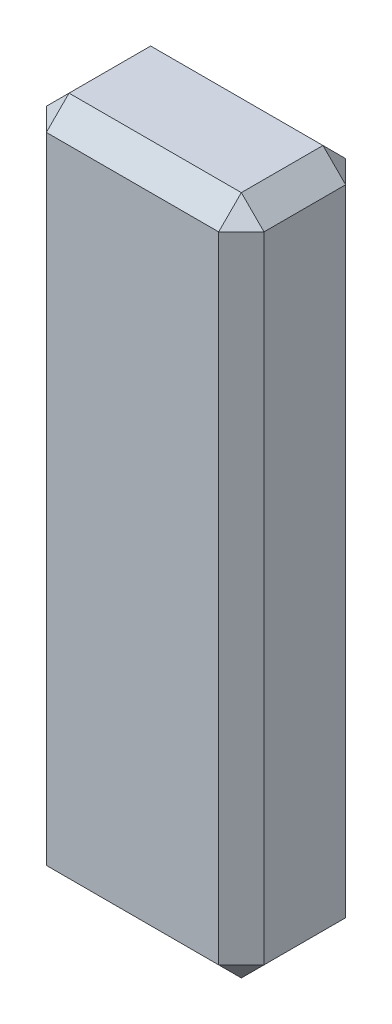
ISO-10303-21;
HEADER;
FILE_DESCRIPTION(('STEP AP214'),'2;1');
FILE_NAME('part.step','',(''),(''),'','','');
FILE_SCHEMA(('AUTOMOTIVE_DESIGN { 1 0 10303 214 1 1 1 1 }'));
ENDSEC;
DATA;
#1=APPLICATION_CONTEXT('core data for automotive mechanical design processes');
#2=APPLICATION_PROTOCOL_DEFINITION('international standard','automotive_design',2000,#1);
#3=PRODUCT_CONTEXT('',#1,'mechanical');
#4=PRODUCT('Part','Part','',(#3));
#5=PRODUCT_RELATED_PRODUCT_CATEGORY('part','',(#4));
#6=PRODUCT_DEFINITION_FORMATION('','',#4);
#7=PRODUCT_DEFINITION_CONTEXT('part definition',#1,'design');
#8=PRODUCT_DEFINITION('design','',#6,#7);
#9=PRODUCT_DEFINITION_SHAPE('','',#8);
#10=(LENGTH_UNIT() NAMED_UNIT(*) SI_UNIT(.MILLI.,.METRE.));
#11=(NAMED_UNIT(*) PLANE_ANGLE_UNIT() SI_UNIT($,.RADIAN.));
#12=(NAMED_UNIT(*) SI_UNIT($,.STERADIAN.) SOLID_ANGLE_UNIT());
#13=UNCERTAINTY_MEASURE_WITH_UNIT(LENGTH_MEASURE(1.E-05),#10,'distance_accuracy_value','');
#14=(GEOMETRIC_REPRESENTATION_CONTEXT(3) GLOBAL_UNCERTAINTY_ASSIGNED_CONTEXT((#13)) GLOBAL_UNIT_ASSIGNED_CONTEXT((#10,
#11,#12)) REPRESENTATION_CONTEXT('',''));
#15=CARTESIAN_POINT('',(0.,0.,0.));
#16=DIRECTION('',(0.,0.,1.));
#17=DIRECTION('',(1.,0.,0.));
#18=AXIS2_PLACEMENT_3D('',#15,#16,#17);
#19=CARTESIAN_POINT('',(2.4,15.,1.4));
#20=DIRECTION('',(-1.,0.,0.));
#21=DIRECTION('',(0.,0.,1.));
#22=AXIS2_PLACEMENT_3D('',#19,#20,#21);
#23=PLANE('',#22);
#24=DIRECTION('',(0.,-1.,0.));
#25=VECTOR('',#24,1.);
#26=CARTESIAN_POINT('',(2.4,15.,0.899999999999998));
#27=LINE('',#26,#25);
#28=CARTESIAN_POINT('',(2.4,14.5,0.899999999999998));
#29=VERTEX_POINT('',#28);
#30=CARTESIAN_POINT('',(2.4,0.500000000000002,0.899999999999998));
#31=VERTEX_POINT('',#30);
#32=EDGE_CURVE('E197',#29,#31,#27,.T.);
#33=ORIENTED_EDGE('',*,*,#32,.T.);
#34=DIRECTION('',(0.,0.,-1.));
#35=VECTOR('',#34,1.);
#36=CARTESIAN_POINT('',(2.4,0.500000000000002,-1.4));
#37=LINE('',#36,#35);
#38=CARTESIAN_POINT('',(2.4,0.500000000000002,-0.899999999999996));
#39=VERTEX_POINT('',#38);
#40=EDGE_CURVE('E200',#31,#39,#37,.T.);
#41=ORIENTED_EDGE('',*,*,#40,.T.);
#42=DIRECTION('',(0.,1.,0.));
#43=VECTOR('',#42,1.);
#44=CARTESIAN_POINT('',(2.4,15.,-0.899999999999996));
#45=LINE('',#44,#43);
#46=CARTESIAN_POINT('',(2.4,14.5,-0.899999999999996));
#47=VERTEX_POINT('',#46);
#48=EDGE_CURVE('E191',#39,#47,#45,.T.);
#49=ORIENTED_EDGE('',*,*,#48,.T.);
#50=DIRECTION('',(0.,0.,1.));
#51=VECTOR('',#50,1.);
#52=CARTESIAN_POINT('',(2.4,14.5,1.4));
#53=LINE('',#52,#51);
#54=EDGE_CURVE('E194',#47,#29,#53,.T.);
#55=ORIENTED_EDGE('',*,*,#54,.T.);
#56=EDGE_LOOP('',(#33,#41,#49,#55));
#57=FACE_BOUND('',#56,.T.);
#58=ADVANCED_FACE('F39',(#57),#23,.F.);
#59=CARTESIAN_POINT('',(-2.4,15.,-1.4));
#60=DIRECTION('',(0.,0.,1.));
#61=DIRECTION('',(1.,0.,0.));
#62=AXIS2_PLACEMENT_3D('',#59,#60,#61);
#63=PLANE('',#62);
#64=DIRECTION('',(1.,0.,0.));
#65=VECTOR('',#64,1.);
#66=CARTESIAN_POINT('',(-2.4,14.5,-1.4));
#67=LINE('',#66,#65);
#68=CARTESIAN_POINT('',(-1.9,14.5,-1.4));
#69=VERTEX_POINT('',#68);
#70=CARTESIAN_POINT('',(1.9,14.5,-1.4));
#71=VERTEX_POINT('',#70);
#72=EDGE_CURVE('E49',#69,#71,#67,.T.);
#73=ORIENTED_EDGE('',*,*,#72,.T.);
#74=DIRECTION('',(0.,-1.,0.));
#75=VECTOR('',#74,1.);
#76=CARTESIAN_POINT('',(1.9,15.,-1.4));
#77=LINE('',#76,#75);
#78=CARTESIAN_POINT('',(1.9,0.500000000000002,-1.4));
#79=VERTEX_POINT('',#78);
#80=EDGE_CURVE('E11',#71,#79,#77,.T.);
#81=ORIENTED_EDGE('',*,*,#80,.T.);
#82=DIRECTION('',(-1.,0.,0.));
#83=VECTOR('',#82,1.);
#84=CARTESIAN_POINT('',(-2.4,0.500000000000002,-1.4));
#85=LINE('',#84,#83);
#86=CARTESIAN_POINT('',(-1.9,0.500000000000002,-1.4));
#87=VERTEX_POINT('',#86);
#88=EDGE_CURVE('E228',#79,#87,#85,.T.);
#89=ORIENTED_EDGE('',*,*,#88,.T.);
#90=DIRECTION('',(0.,1.,0.));
#91=VECTOR('',#90,1.);
#92=CARTESIAN_POINT('',(-1.9,15.,-1.4));
#93=LINE('',#92,#91);
#94=EDGE_CURVE('E60',#87,#69,#93,.T.);
#95=ORIENTED_EDGE('',*,*,#94,.T.);
#96=EDGE_LOOP('',(#73,#81,#89,#95));
#97=FACE_BOUND('',#96,.T.);
#98=ADVANCED_FACE('F361',(#97),#63,.F.);
#99=CARTESIAN_POINT('',(-2.4,15.,1.4));
#100=DIRECTION('',(1.,0.,0.));
#101=DIRECTION('',(0.,0.,-1.));
#102=AXIS2_PLACEMENT_3D('',#99,#100,#101);
#103=PLANE('',#102);
#104=DIRECTION('',(0.,0.,1.));
#105=VECTOR('',#104,1.);
#106=CARTESIAN_POINT('',(-2.4,0.500000000000002,1.4));
#107=LINE('',#106,#105);
#108=CARTESIAN_POINT('',(-2.4,0.500000000000002,-0.899999999999996));
#109=VERTEX_POINT('',#108);
#110=CARTESIAN_POINT('',(-2.4,0.500000000000002,0.899999999999996));
#111=VERTEX_POINT('',#110);
#112=EDGE_CURVE('E140',#109,#111,#107,.T.);
#113=ORIENTED_EDGE('',*,*,#112,.T.);
#114=DIRECTION('',(0.,1.,0.));
#115=VECTOR('',#114,1.);
#116=CARTESIAN_POINT('',(-2.4,15.,0.899999999999996));
#117=LINE('',#116,#115);
#118=CARTESIAN_POINT('',(-2.4,14.5,0.899999999999996));
#119=VERTEX_POINT('',#118);
#120=EDGE_CURVE('E135',#111,#119,#117,.T.);
#121=ORIENTED_EDGE('',*,*,#120,.T.);
#122=DIRECTION('',(0.,0.,-1.));
#123=VECTOR('',#122,1.);
#124=CARTESIAN_POINT('',(-2.4,14.5,1.4));
#125=LINE('',#124,#123);
#126=CARTESIAN_POINT('',(-2.4,14.5,-0.899999999999996));
#127=VERTEX_POINT('',#126);
#128=EDGE_CURVE('E127',#119,#127,#125,.T.);
#129=ORIENTED_EDGE('',*,*,#128,.T.);
#130=DIRECTION('',(0.,-1.,0.));
#131=VECTOR('',#130,1.);
#132=CARTESIAN_POINT('',(-2.4,15.,-0.899999999999996));
#133=LINE('',#132,#131);
#134=EDGE_CURVE('E132',#127,#109,#133,.T.);
#135=ORIENTED_EDGE('',*,*,#134,.T.);
#136=EDGE_LOOP('',(#113,#121,#129,#135));
#137=FACE_BOUND('',#136,.T.);
#138=ADVANCED_FACE('F130',(#137),#103,.F.);
#139=CARTESIAN_POINT('',(-2.4,15.,1.4));
#140=DIRECTION('',(0.,0.,-1.));
#141=DIRECTION('',(-1.,0.,0.));
#142=AXIS2_PLACEMENT_3D('',#139,#140,#141);
#143=PLANE('',#142);
#144=DIRECTION('',(-1.,0.,0.));
#145=VECTOR('',#144,1.);
#146=CARTESIAN_POINT('',(-2.4,14.5,1.4));
#147=LINE('',#146,#145);
#148=CARTESIAN_POINT('',(1.9,14.5,1.4));
#149=VERTEX_POINT('',#148);
#150=CARTESIAN_POINT('',(-1.9,14.5,1.4));
#151=VERTEX_POINT('',#150);
#152=EDGE_CURVE('E221',#149,#151,#147,.T.);
#153=ORIENTED_EDGE('',*,*,#152,.T.);
#154=DIRECTION('',(0.,-1.,0.));
#155=VECTOR('',#154,1.);
#156=CARTESIAN_POINT('',(-1.9,15.,1.4));
#157=LINE('',#156,#155);
#158=CARTESIAN_POINT('',(-1.9,0.500000000000002,1.4));
#159=VERTEX_POINT('',#158);
#160=EDGE_CURVE('E224',#151,#159,#157,.T.);
#161=ORIENTED_EDGE('',*,*,#160,.T.);
#162=DIRECTION('',(1.,0.,0.));
#163=VECTOR('',#162,1.);
#164=CARTESIAN_POINT('',(2.4,0.500000000000002,1.4));
#165=LINE('',#164,#163);
#166=CARTESIAN_POINT('',(1.9,0.500000000000002,1.4));
#167=VERTEX_POINT('',#166);
#168=EDGE_CURVE('E218',#159,#167,#165,.T.);
#169=ORIENTED_EDGE('',*,*,#168,.T.);
#170=DIRECTION('',(0.,1.,0.));
#171=VECTOR('',#170,1.);
#172=CARTESIAN_POINT('',(1.9,15.,1.4));
#173=LINE('',#172,#171);
#174=EDGE_CURVE('E215',#167,#149,#173,.T.);
#175=ORIENTED_EDGE('',*,*,#174,.T.);
#176=EDGE_LOOP('',(#153,#161,#169,#175));
#177=FACE_BOUND('',#176,.T.);
#178=ADVANCED_FACE('F318',(#177),#143,.F.);
#179=CARTESIAN_POINT('',(0.,15.,0.));
#180=DIRECTION('',(0.,-1.,0.));
#181=DIRECTION('',(0.,0.,-1.));
#182=AXIS2_PLACEMENT_3D('',#179,#180,#181);
#183=PLANE('',#182);
#184=DIRECTION('',(-1.,0.,0.));
#185=VECTOR('',#184,1.);
#186=CARTESIAN_POINT('',(0.,15.,-0.899999999999996));
#187=LINE('',#186,#185);
#188=CARTESIAN_POINT('',(1.9,15.,-0.899999999999996));
#189=VERTEX_POINT('',#188);
#190=CARTESIAN_POINT('',(-1.9,15.,-0.899999999999996));
#191=VERTEX_POINT('',#190);
#192=EDGE_CURVE('E204',#189,#191,#187,.T.);
#193=ORIENTED_EDGE('',*,*,#192,.T.);
#194=DIRECTION('',(0.,0.,1.));
#195=VECTOR('',#194,1.);
#196=CARTESIAN_POINT('',(-1.9,15.,0.));
#197=LINE('',#196,#195);
#198=CARTESIAN_POINT('',(-1.9,15.,0.899999999999998));
#199=VERTEX_POINT('',#198);
#200=EDGE_CURVE('E148',#191,#199,#197,.T.);
#201=ORIENTED_EDGE('',*,*,#200,.T.);
#202=DIRECTION('',(1.,0.,0.));
#203=VECTOR('',#202,1.);
#204=CARTESIAN_POINT('',(0.,15.,0.899999999999998));
#205=LINE('',#204,#203);
#206=CARTESIAN_POINT('',(1.9,15.,0.899999999999998));
#207=VERTEX_POINT('',#206);
#208=EDGE_CURVE('E210',#199,#207,#205,.T.);
#209=ORIENTED_EDGE('',*,*,#208,.T.);
#210=DIRECTION('',(0.,0.,-1.));
#211=VECTOR('',#210,1.);
#212=CARTESIAN_POINT('',(1.9,15.,0.));
#213=LINE('',#212,#211);
#214=EDGE_CURVE('E207',#207,#189,#213,.T.);
#215=ORIENTED_EDGE('',*,*,#214,.T.);
#216=EDGE_LOOP('',(#193,#201,#209,#215));
#217=FACE_BOUND('',#216,.T.);
#218=ADVANCED_FACE('F349',(#217),#183,.F.);
#219=CARTESIAN_POINT('',(0.,0.,0.));
#220=DIRECTION('',(0.,-1.,0.));
#221=DIRECTION('',(0.,0.,-1.));
#222=AXIS2_PLACEMENT_3D('',#219,#220,#221);
#223=PLANE('',#222);
#224=DIRECTION('',(0.,0.,1.));
#225=VECTOR('',#224,1.);
#226=CARTESIAN_POINT('',(1.9,0.,1.4));
#227=LINE('',#226,#225);
#228=CARTESIAN_POINT('',(1.9,0.,-0.899999999999996));
#229=VERTEX_POINT('',#228);
#230=CARTESIAN_POINT('',(1.9,0.,0.899999999999996));
#231=VERTEX_POINT('',#230);
#232=EDGE_CURVE('E181',#229,#231,#227,.T.);
#233=ORIENTED_EDGE('',*,*,#232,.T.);
#234=DIRECTION('',(-1.,0.,0.));
#235=VECTOR('',#234,1.);
#236=CARTESIAN_POINT('',(-2.4,0.,0.899999999999996));
#237=LINE('',#236,#235);
#238=CARTESIAN_POINT('',(-1.9,0.,0.899999999999996));
#239=VERTEX_POINT('',#238);
#240=EDGE_CURVE('E188',#231,#239,#237,.T.);
#241=ORIENTED_EDGE('',*,*,#240,.T.);
#242=DIRECTION('',(0.,0.,-1.));
#243=VECTOR('',#242,1.);
#244=CARTESIAN_POINT('',(-1.9,0.,-1.4));
#245=LINE('',#244,#243);
#246=CARTESIAN_POINT('',(-1.9,0.,-0.899999999999996));
#247=VERTEX_POINT('',#246);
#248=EDGE_CURVE('E184',#239,#247,#245,.T.);
#249=ORIENTED_EDGE('',*,*,#248,.T.);
#250=DIRECTION('',(1.,0.,0.));
#251=VECTOR('',#250,1.);
#252=CARTESIAN_POINT('',(2.4,0.,-0.899999999999996));
#253=LINE('',#252,#251);
#254=EDGE_CURVE('E178',#247,#229,#253,.T.);
#255=ORIENTED_EDGE('',*,*,#254,.T.);
#256=EDGE_LOOP('',(#233,#241,#249,#255));
#257=FACE_BOUND('',#256,.T.);
#258=ADVANCED_FACE('F351',(#257),#223,.T.);
#259=CARTESIAN_POINT('',(1.9,15.,0.));
#260=DIRECTION('',(-0.707106781186549,-0.707106781186546,0.));
#261=DIRECTION('',(0.,0.,-1.));
#262=AXIS2_PLACEMENT_3D('',#259,#260,#261);
#263=PLANE('',#262);
#264=DIRECTION('',(-0.707106781186546,0.707106781186549,0.));
#265=VECTOR('',#264,1.);
#266=CARTESIAN_POINT('',(1.9,15.,-0.899999999999996));
#267=LINE('',#266,#265);
#268=EDGE_CURVE('E43',#189,#47,#267,.F.);
#269=ORIENTED_EDGE('',*,*,#268,.F.);
#270=ORIENTED_EDGE('',*,*,#214,.F.);
#271=DIRECTION('',(0.707106781186546,-0.707106781186549,0.));
#272=VECTOR('',#271,1.);
#273=CARTESIAN_POINT('',(1.9,15.,0.899999999999998));
#274=LINE('',#273,#272);
#275=EDGE_CURVE('E172',#29,#207,#274,.F.);
#276=ORIENTED_EDGE('',*,*,#275,.F.);
#277=ORIENTED_EDGE('',*,*,#54,.F.);
#278=EDGE_LOOP('',(#269,#270,#276,#277));
#279=FACE_BOUND('',#278,.T.);
#280=ADVANCED_FACE('F41',(#279),#263,.F.);
#281=CARTESIAN_POINT('',(1.9,15.,-0.899999999999996));
#282=DIRECTION('',(0.577350269189628,0.577350269189626,-0.577350269189624));
#283=DIRECTION('',(-0.707106781186546,0.707106781186549,0.));
#284=AXIS2_PLACEMENT_3D('',#281,#282,#283);
#285=PLANE('',#284);
#286=DIRECTION('',(0.,-0.707106781186546,-0.707106781186549));
#287=VECTOR('',#286,1.);
#288=CARTESIAN_POINT('',(1.9,15.,-0.899999999999996));
#289=LINE('',#288,#287);
#290=EDGE_CURVE('E294',#189,#71,#289,.T.);
#291=ORIENTED_EDGE('',*,*,#290,.F.);
#292=ORIENTED_EDGE('',*,*,#268,.T.);
#293=DIRECTION('',(0.707106781186546,0.,0.707106781186549));
#294=VECTOR('',#293,1.);
#295=CARTESIAN_POINT('',(2.15,14.5,-1.15));
#296=LINE('',#295,#294);
#297=EDGE_CURVE('E297',#71,#47,#296,.T.);
#298=ORIENTED_EDGE('',*,*,#297,.F.);
#299=EDGE_LOOP('',(#291,#292,#298));
#300=FACE_BOUND('',#299,.T.);
#301=ADVANCED_FACE('F344',(#300),#285,.T.);
#302=CARTESIAN_POINT('',(1.9,15.,0.899999999999998));
#303=DIRECTION('',(0.577350269189626,0.577350269189624,0.577350269189628));
#304=DIRECTION('',(0.707106781186549,0.,-0.707106781186546));
#305=AXIS2_PLACEMENT_3D('',#302,#303,#304);
#306=PLANE('',#305);
#307=DIRECTION('',(-0.707106781186549,0.,0.707106781186546));
#308=VECTOR('',#307,1.);
#309=CARTESIAN_POINT('',(2.15,14.5,1.15));
#310=LINE('',#309,#308);
#311=EDGE_CURVE('E286',#29,#149,#310,.T.);
#312=ORIENTED_EDGE('',*,*,#311,.F.);
#313=ORIENTED_EDGE('',*,*,#275,.T.);
#314=DIRECTION('',(0.,0.707106781186549,-0.707106781186546));
#315=VECTOR('',#314,1.);
#316=CARTESIAN_POINT('',(1.9,15.,0.899999999999998));
#317=LINE('',#316,#315);
#318=EDGE_CURVE('E290',#149,#207,#317,.T.);
#319=ORIENTED_EDGE('',*,*,#318,.F.);
#320=EDGE_LOOP('',(#312,#313,#319));
#321=FACE_BOUND('',#320,.T.);
#322=ADVANCED_FACE('F306',(#321),#306,.T.);
#323=CARTESIAN_POINT('',(1.9,15.,-1.4));
#324=DIRECTION('',(-0.707106781186549,0.,0.707106781186546));
#325=DIRECTION('',(0.,-1.,0.));
#326=AXIS2_PLACEMENT_3D('',#323,#324,#325);
#327=PLANE('',#326);
#328=ORIENTED_EDGE('',*,*,#297,.T.);
#329=ORIENTED_EDGE('',*,*,#48,.F.);
#330=DIRECTION('',(-0.707106781186546,0.,-0.707106781186549));
#331=VECTOR('',#330,1.);
#332=CARTESIAN_POINT('',(2.4,0.500000000000002,-0.899999999999996));
#333=LINE('',#332,#331);
#334=EDGE_CURVE('E279',#79,#39,#333,.F.);
#335=ORIENTED_EDGE('',*,*,#334,.F.);
#336=ORIENTED_EDGE('',*,*,#80,.F.);
#337=EDGE_LOOP('',(#328,#329,#335,#336));
#338=FACE_BOUND('',#337,.T.);
#339=ADVANCED_FACE('F338',(#338),#327,.F.);
#340=CARTESIAN_POINT('',(0.,15.,-0.899999999999996));
#341=DIRECTION('',(0.,-0.707106781186549,0.707106781186546));
#342=DIRECTION('',(-1.,0.,0.));
#343=AXIS2_PLACEMENT_3D('',#340,#341,#342);
#344=PLANE('',#343);
#345=ORIENTED_EDGE('',*,*,#290,.T.);
#346=ORIENTED_EDGE('',*,*,#72,.F.);
#347=DIRECTION('',(0.,0.707106781186546,0.707106781186549));
#348=VECTOR('',#347,1.);
#349=CARTESIAN_POINT('',(-1.9,14.75,-1.15));
#350=LINE('',#349,#348);
#351=EDGE_CURVE('E153',#191,#69,#350,.F.);
#352=ORIENTED_EDGE('',*,*,#351,.F.);
#353=ORIENTED_EDGE('',*,*,#192,.F.);
#354=EDGE_LOOP('',(#345,#346,#352,#353));
#355=FACE_BOUND('',#354,.T.);
#356=ADVANCED_FACE('F347',(#355),#344,.F.);
#357=CARTESIAN_POINT('',(-1.9,15.,0.));
#358=DIRECTION('',(0.707106781186549,-0.707106781186546,0.));
#359=DIRECTION('',(0.,0.,1.));
#360=AXIS2_PLACEMENT_3D('',#357,#358,#359);
#361=PLANE('',#360);
#362=DIRECTION('',(0.707106781186546,0.707106781186549,0.));
#363=VECTOR('',#362,1.);
#364=CARTESIAN_POINT('',(-1.9,15.,0.899999999999998));
#365=LINE('',#364,#363);
#366=EDGE_CURVE('E154',#199,#119,#365,.F.);
#367=ORIENTED_EDGE('',*,*,#366,.F.);
#368=ORIENTED_EDGE('',*,*,#200,.F.);
#369=DIRECTION('',(-0.707106781186546,-0.707106781186549,0.));
#370=VECTOR('',#369,1.);
#371=CARTESIAN_POINT('',(-2.4,14.5,-0.899999999999996));
#372=LINE('',#371,#370);
#373=EDGE_CURVE('E144',#127,#191,#372,.F.);
#374=ORIENTED_EDGE('',*,*,#373,.F.);
#375=ORIENTED_EDGE('',*,*,#128,.F.);
#376=EDGE_LOOP('',(#367,#368,#374,#375));
#377=FACE_BOUND('',#376,.T.);
#378=ADVANCED_FACE('F146',(#377),#361,.F.);
#379=CARTESIAN_POINT('',(0.,15.,0.899999999999998));
#380=DIRECTION('',(0.,-0.707106781186546,-0.707106781186549));
#381=DIRECTION('',(1.,0.,0.));
#382=AXIS2_PLACEMENT_3D('',#379,#380,#381);
#383=PLANE('',#382);
#384=ORIENTED_EDGE('',*,*,#318,.T.);
#385=ORIENTED_EDGE('',*,*,#208,.F.);
#386=DIRECTION('',(0.,-0.707106781186549,0.707106781186546));
#387=VECTOR('',#386,1.);
#388=CARTESIAN_POINT('',(-1.9,15.,0.899999999999998));
#389=LINE('',#388,#387);
#390=EDGE_CURVE('E272',#151,#199,#389,.F.);
#391=ORIENTED_EDGE('',*,*,#390,.F.);
#392=ORIENTED_EDGE('',*,*,#152,.F.);
#393=EDGE_LOOP('',(#384,#385,#391,#392));
#394=FACE_BOUND('',#393,.T.);
#395=ADVANCED_FACE('F314',(#394),#383,.F.);
#396=CARTESIAN_POINT('',(2.4,15.,0.899999999999998));
#397=DIRECTION('',(-0.707106781186546,0.,-0.707106781186549));
#398=DIRECTION('',(0.,-1.,0.));
#399=AXIS2_PLACEMENT_3D('',#396,#397,#398);
#400=PLANE('',#399);
#401=ORIENTED_EDGE('',*,*,#311,.T.);
#402=ORIENTED_EDGE('',*,*,#174,.F.);
#403=DIRECTION('',(0.707106781186549,0.,-0.707106781186546));
#404=VECTOR('',#403,1.);
#405=CARTESIAN_POINT('',(2.15,0.500000000000002,1.15));
#406=LINE('',#405,#404);
#407=EDGE_CURVE('E268',#31,#167,#406,.F.);
#408=ORIENTED_EDGE('',*,*,#407,.F.);
#409=ORIENTED_EDGE('',*,*,#32,.F.);
#410=EDGE_LOOP('',(#401,#402,#408,#409));
#411=FACE_BOUND('',#410,.T.);
#412=ADVANCED_FACE('F324',(#411),#400,.F.);
#413=CARTESIAN_POINT('',(2.4,0.500000000000002,1.4));
#414=DIRECTION('',(0.707106781186546,-0.707106781186549,0.));
#415=DIRECTION('',(0.,0.,1.));
#416=AXIS2_PLACEMENT_3D('',#413,#414,#415);
#417=PLANE('',#416);
#418=DIRECTION('',(-0.707106781186549,-0.707106781186546,0.));
#419=VECTOR('',#418,1.);
#420=CARTESIAN_POINT('',(2.4,0.500000000000002,-0.899999999999996));
#421=LINE('',#420,#419);
#422=EDGE_CURVE('E282',#39,#229,#421,.T.);
#423=ORIENTED_EDGE('',*,*,#422,.F.);
#424=ORIENTED_EDGE('',*,*,#40,.F.);
#425=DIRECTION('',(0.707106781186549,0.707106781186546,0.));
#426=VECTOR('',#425,1.);
#427=CARTESIAN_POINT('',(1.9,0.,0.899999999999996));
#428=LINE('',#427,#426);
#429=EDGE_CURVE('E264',#231,#31,#428,.T.);
#430=ORIENTED_EDGE('',*,*,#429,.F.);
#431=ORIENTED_EDGE('',*,*,#232,.F.);
#432=EDGE_LOOP('',(#423,#424,#430,#431));
#433=FACE_BOUND('',#432,.T.);
#434=ADVANCED_FACE('F330',(#433),#417,.T.);
#435=CARTESIAN_POINT('',(2.4,0.500000000000002,-0.899999999999996));
#436=DIRECTION('',(0.577350269189626,-0.577350269189628,-0.577350269189624));
#437=DIRECTION('',(0.707106781186549,0.707106781186546,0.));
#438=AXIS2_PLACEMENT_3D('',#435,#436,#437);
#439=PLANE('',#438);
#440=ORIENTED_EDGE('',*,*,#334,.T.);
#441=ORIENTED_EDGE('',*,*,#422,.T.);
#442=DIRECTION('',(0.,0.707106781186546,-0.707106781186549));
#443=VECTOR('',#442,1.);
#444=CARTESIAN_POINT('',(1.9,0.250000000000001,-1.15));
#445=LINE('',#444,#443);
#446=EDGE_CURVE('E161',#79,#229,#445,.F.);
#447=ORIENTED_EDGE('',*,*,#446,.F.);
#448=EDGE_LOOP('',(#440,#441,#447));
#449=FACE_BOUND('',#448,.T.);
#450=ADVANCED_FACE('F405',(#449),#439,.T.);
#451=CARTESIAN_POINT('',(-2.4,14.5,-0.899999999999996));
#452=DIRECTION('',(-0.577350269189628,0.577350269189626,-0.577350269189624));
#453=DIRECTION('',(-0.707106781186546,-0.707106781186549,0.));
#454=AXIS2_PLACEMENT_3D('',#451,#452,#453);
#455=PLANE('',#454);
#456=ORIENTED_EDGE('',*,*,#373,.T.);
#457=ORIENTED_EDGE('',*,*,#351,.T.);
#458=DIRECTION('',(0.707106781186546,0.,-0.707106781186549));
#459=VECTOR('',#458,1.);
#460=CARTESIAN_POINT('',(-2.4,14.5,-0.899999999999996));
#461=LINE('',#460,#459);
#462=EDGE_CURVE('E157',#127,#69,#461,.T.);
#463=ORIENTED_EDGE('',*,*,#462,.F.);
#464=EDGE_LOOP('',(#456,#457,#463));
#465=FACE_BOUND('',#464,.T.);
#466=ADVANCED_FACE('F158',(#465),#455,.T.);
#467=CARTESIAN_POINT('',(-1.9,15.,0.899999999999998));
#468=DIRECTION('',(-0.577350269189628,0.577350269189624,0.577350269189626));
#469=DIRECTION('',(0.707106781186546,0.,0.707106781186549));
#470=AXIS2_PLACEMENT_3D('',#467,#468,#469);
#471=PLANE('',#470);
#472=ORIENTED_EDGE('',*,*,#390,.T.);
#473=ORIENTED_EDGE('',*,*,#366,.T.);
#474=DIRECTION('',(-0.707106781186546,0.,-0.707106781186549));
#475=VECTOR('',#474,1.);
#476=CARTESIAN_POINT('',(-2.15,14.5,1.15));
#477=LINE('',#476,#475);
#478=EDGE_CURVE('E162',#151,#119,#477,.T.);
#479=ORIENTED_EDGE('',*,*,#478,.F.);
#480=EDGE_LOOP('',(#472,#473,#479));
#481=FACE_BOUND('',#480,.T.);
#482=ADVANCED_FACE('F398',(#481),#471,.T.);
#483=CARTESIAN_POINT('',(1.9,0.,0.899999999999996));
#484=DIRECTION('',(0.577350269189624,-0.577350269189628,0.577350269189626));
#485=DIRECTION('',(0.,-0.707106781186546,-0.707106781186549));
#486=AXIS2_PLACEMENT_3D('',#483,#484,#485);
#487=PLANE('',#486);
#488=ORIENTED_EDGE('',*,*,#429,.T.);
#489=ORIENTED_EDGE('',*,*,#407,.T.);
#490=DIRECTION('',(0.,-0.707106781186546,-0.707106781186549));
#491=VECTOR('',#490,1.);
#492=CARTESIAN_POINT('',(1.9,0.,0.899999999999996));
#493=LINE('',#492,#491);
#494=EDGE_CURVE('E254',#231,#167,#493,.F.);
#495=ORIENTED_EDGE('',*,*,#494,.F.);
#496=EDGE_LOOP('',(#488,#489,#495));
#497=FACE_BOUND('',#496,.T.);
#498=ADVANCED_FACE('F394',(#497),#487,.T.);
#499=CARTESIAN_POINT('',(-2.4,0.500000000000002,-1.4));
#500=DIRECTION('',(0.,-0.707106781186549,-0.707106781186546));
#501=DIRECTION('',(1.,0.,0.));
#502=AXIS2_PLACEMENT_3D('',#499,#500,#501);
#503=PLANE('',#502);
#504=ORIENTED_EDGE('',*,*,#446,.T.);
#505=ORIENTED_EDGE('',*,*,#254,.F.);
#506=DIRECTION('',(0.,-0.707106781186546,0.707106781186549));
#507=VECTOR('',#506,1.);
#508=CARTESIAN_POINT('',(-1.9,0.,-0.899999999999996));
#509=LINE('',#508,#507);
#510=EDGE_CURVE('E250',#87,#247,#509,.T.);
#511=ORIENTED_EDGE('',*,*,#510,.F.);
#512=ORIENTED_EDGE('',*,*,#88,.F.);
#513=EDGE_LOOP('',(#504,#505,#511,#512));
#514=FACE_BOUND('',#513,.T.);
#515=ADVANCED_FACE('F391',(#514),#503,.T.);
#516=CARTESIAN_POINT('',(-2.4,15.,-0.899999999999996));
#517=DIRECTION('',(0.707106781186549,0.,0.707106781186546));
#518=DIRECTION('',(0.,-1.,0.));
#519=AXIS2_PLACEMENT_3D('',#516,#517,#518);
#520=PLANE('',#519);
#521=ORIENTED_EDGE('',*,*,#462,.T.);
#522=ORIENTED_EDGE('',*,*,#94,.F.);
#523=DIRECTION('',(-0.707106781186546,0.,0.707106781186549));
#524=VECTOR('',#523,1.);
#525=CARTESIAN_POINT('',(-2.15,0.500000000000002,-1.15));
#526=LINE('',#525,#524);
#527=EDGE_CURVE('E166',#109,#87,#526,.F.);
#528=ORIENTED_EDGE('',*,*,#527,.F.);
#529=ORIENTED_EDGE('',*,*,#134,.F.);
#530=EDGE_LOOP('',(#521,#522,#528,#529));
#531=FACE_BOUND('',#530,.T.);
#532=ADVANCED_FACE('F164',(#531),#520,.F.);
#533=CARTESIAN_POINT('',(-1.9,15.,1.4));
#534=DIRECTION('',(0.707106781186549,0.,-0.707106781186546));
#535=DIRECTION('',(0.,-1.,0.));
#536=AXIS2_PLACEMENT_3D('',#533,#534,#535);
#537=PLANE('',#536);
#538=ORIENTED_EDGE('',*,*,#478,.T.);
#539=ORIENTED_EDGE('',*,*,#120,.F.);
#540=DIRECTION('',(0.707106781186546,0.,0.707106781186549));
#541=VECTOR('',#540,1.);
#542=CARTESIAN_POINT('',(-2.4,0.500000000000002,0.899999999999996));
#543=LINE('',#542,#541);
#544=EDGE_CURVE('E244',#159,#111,#543,.F.);
#545=ORIENTED_EDGE('',*,*,#544,.F.);
#546=ORIENTED_EDGE('',*,*,#160,.F.);
#547=EDGE_LOOP('',(#538,#539,#545,#546));
#548=FACE_BOUND('',#547,.T.);
#549=ADVANCED_FACE('F384',(#548),#537,.F.);
#550=CARTESIAN_POINT('',(-2.4,0.500000000000002,1.4));
#551=DIRECTION('',(0.,-0.707106781186549,0.707106781186546));
#552=DIRECTION('',(-1.,0.,0.));
#553=AXIS2_PLACEMENT_3D('',#550,#551,#552);
#554=PLANE('',#553);
#555=ORIENTED_EDGE('',*,*,#494,.T.);
#556=ORIENTED_EDGE('',*,*,#168,.F.);
#557=DIRECTION('',(0.,0.707106781186546,0.707106781186549));
#558=VECTOR('',#557,1.);
#559=CARTESIAN_POINT('',(-1.9,0.250000000000001,1.15));
#560=LINE('',#559,#558);
#561=EDGE_CURVE('E241',#239,#159,#560,.T.);
#562=ORIENTED_EDGE('',*,*,#561,.F.);
#563=ORIENTED_EDGE('',*,*,#240,.F.);
#564=EDGE_LOOP('',(#555,#556,#562,#563));
#565=FACE_BOUND('',#564,.T.);
#566=ADVANCED_FACE('F380',(#565),#554,.T.);
#567=CARTESIAN_POINT('',(-1.9,0.,-0.899999999999996));
#568=DIRECTION('',(-0.577350269189626,-0.577350269189628,-0.577350269189624));
#569=DIRECTION('',(0.707106781186549,-0.707106781186546,0.));
#570=AXIS2_PLACEMENT_3D('',#567,#568,#569);
#571=PLANE('',#570);
#572=ORIENTED_EDGE('',*,*,#527,.T.);
#573=ORIENTED_EDGE('',*,*,#510,.T.);
#574=DIRECTION('',(-0.707106781186549,0.707106781186546,0.));
#575=VECTOR('',#574,1.);
#576=CARTESIAN_POINT('',(-1.9,0.,-0.899999999999996));
#577=LINE('',#576,#575);
#578=EDGE_CURVE('E238',#109,#247,#577,.F.);
#579=ORIENTED_EDGE('',*,*,#578,.F.);
#580=EDGE_LOOP('',(#572,#573,#579));
#581=FACE_BOUND('',#580,.T.);
#582=ADVANCED_FACE('F376',(#581),#571,.T.);
#583=CARTESIAN_POINT('',(-2.4,0.500000000000002,0.899999999999996));
#584=DIRECTION('',(-0.577350269189626,-0.577350269189628,0.577350269189624));
#585=DIRECTION('',(0.707106781186549,-0.707106781186546,0.));
#586=AXIS2_PLACEMENT_3D('',#583,#584,#585);
#587=PLANE('',#586);
#588=ORIENTED_EDGE('',*,*,#561,.T.);
#589=ORIENTED_EDGE('',*,*,#544,.T.);
#590=DIRECTION('',(0.707106781186549,-0.707106781186546,0.));
#591=VECTOR('',#590,1.);
#592=CARTESIAN_POINT('',(-2.4,0.500000000000002,0.899999999999996));
#593=LINE('',#592,#591);
#594=EDGE_CURVE('E235',#239,#111,#593,.F.);
#595=ORIENTED_EDGE('',*,*,#594,.F.);
#596=EDGE_LOOP('',(#588,#589,#595));
#597=FACE_BOUND('',#596,.T.);
#598=ADVANCED_FACE('F372',(#597),#587,.T.);
#599=CARTESIAN_POINT('',(-2.4,0.500000000000002,1.4));
#600=DIRECTION('',(-0.707106781186546,-0.707106781186549,0.));
#601=DIRECTION('',(0.,0.,-1.));
#602=AXIS2_PLACEMENT_3D('',#599,#600,#601);
#603=PLANE('',#602);
#604=ORIENTED_EDGE('',*,*,#578,.T.);
#605=ORIENTED_EDGE('',*,*,#248,.F.);
#606=ORIENTED_EDGE('',*,*,#594,.T.);
#607=ORIENTED_EDGE('',*,*,#112,.F.);
#608=EDGE_LOOP('',(#604,#605,#606,#607));
#609=FACE_BOUND('',#608,.T.);
#610=ADVANCED_FACE('F369',(#609),#603,.T.);
#611=CLOSED_SHELL('',(#58,#98,#138,#178,#218,#258,#280,#301,#322,#339,#356,#378,#395,#412,#434,
#450,#466,#482,#498,#515,#532,#549,#566,#582,#598,#610));
#612=MANIFOLD_SOLID_BREP('B2',#611);
#613=ADVANCED_BREP_SHAPE_REPRESENTATION('',(#18,#612),#14);
#614=SHAPE_DEFINITION_REPRESENTATION(#9,#613);
ENDSEC;
END-ISO-10303-21;
